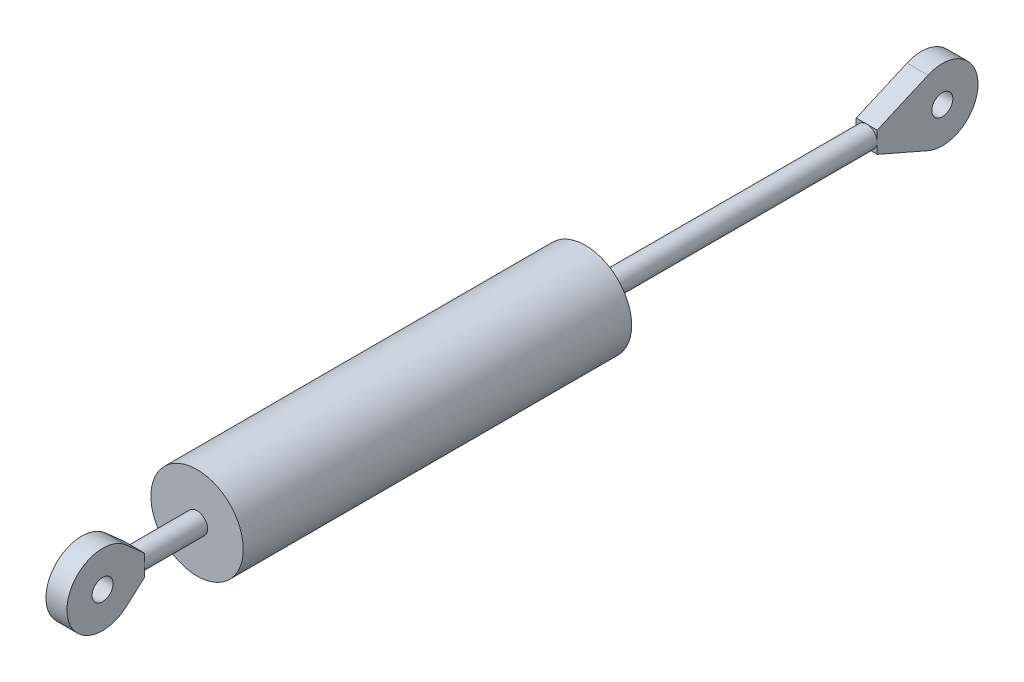
ISO-10303-21;
HEADER;
FILE_DESCRIPTION(('STEP AP214'),'2;1');
FILE_NAME('part.step','',(''),(''),'','','');
FILE_SCHEMA(('AUTOMOTIVE_DESIGN { 1 0 10303 214 1 1 1 1 }'));
ENDSEC;
DATA;
#1=APPLICATION_CONTEXT('core data for automotive mechanical design processes');
#2=APPLICATION_PROTOCOL_DEFINITION('international standard','automotive_design',2000,#1);
#3=PRODUCT_CONTEXT('',#1,'mechanical');
#4=PRODUCT('Part','Part','',(#3));
#5=PRODUCT_RELATED_PRODUCT_CATEGORY('part','',(#4));
#6=PRODUCT_DEFINITION_FORMATION('','',#4);
#7=PRODUCT_DEFINITION_CONTEXT('part definition',#1,'design');
#8=PRODUCT_DEFINITION('design','',#6,#7);
#9=PRODUCT_DEFINITION_SHAPE('','',#8);
#10=(LENGTH_UNIT() NAMED_UNIT(*) SI_UNIT(.MILLI.,.METRE.));
#11=(NAMED_UNIT(*) PLANE_ANGLE_UNIT() SI_UNIT($,.RADIAN.));
#12=(NAMED_UNIT(*) SI_UNIT($,.STERADIAN.) SOLID_ANGLE_UNIT());
#13=UNCERTAINTY_MEASURE_WITH_UNIT(LENGTH_MEASURE(1.E-05),#10,'distance_accuracy_value','');
#14=(GEOMETRIC_REPRESENTATION_CONTEXT(3) GLOBAL_UNCERTAINTY_ASSIGNED_CONTEXT((#13)) GLOBAL_UNIT_ASSIGNED_CONTEXT((#10,
#11,#12)) REPRESENTATION_CONTEXT('',''));
#15=CARTESIAN_POINT('',(0.,0.,0.));
#16=DIRECTION('',(0.,0.,1.));
#17=DIRECTION('',(1.,0.,0.));
#18=AXIS2_PLACEMENT_3D('',#15,#16,#17);
#19=CARTESIAN_POINT('',(0.,11.,46.25));
#20=DIRECTION('',(0.,0.,-1.));
#21=DIRECTION('',(-1.,0.,0.));
#22=AXIS2_PLACEMENT_3D('',#19,#20,#21);
#23=PLANE('',#22);
#24=CARTESIAN_POINT('',(0.,0.,46.25));
#25=DIRECTION('',(0.,0.,1.));
#26=DIRECTION('',(1.,0.,0.));
#27=AXIS2_PLACEMENT_3D('',#24,#25,#26);
#28=CIRCLE('',#27,2.5);
#29=CARTESIAN_POINT('',(2.5,0.,46.25));
#30=VERTEX_POINT('',#29);
#31=EDGE_CURVE('E43',#30,#30,#28,.T.);
#32=ORIENTED_EDGE('',*,*,#31,.F.);
#33=EDGE_LOOP('',(#32));
#34=FACE_BOUND('',#33,.T.);
#35=CARTESIAN_POINT('',(0.,0.,46.25));
#36=DIRECTION('',(0.,0.,1.));
#37=DIRECTION('',(1.,0.,0.));
#38=AXIS2_PLACEMENT_3D('',#35,#36,#37);
#39=CIRCLE('',#38,11.);
#40=CARTESIAN_POINT('',(11.,0.,46.25));
#41=VERTEX_POINT('',#40);
#42=EDGE_CURVE('E230',#41,#41,#39,.T.);
#43=ORIENTED_EDGE('',*,*,#42,.T.);
#44=EDGE_LOOP('',(#43));
#45=FACE_BOUND('',#44,.T.);
#46=ADVANCED_FACE('F35',(#34,#45),#23,.F.);
#47=CARTESIAN_POINT('',(0.,11.,-46.25));
#48=DIRECTION('',(0.,0.,1.));
#49=DIRECTION('',(1.,0.,0.));
#50=AXIS2_PLACEMENT_3D('',#47,#48,#49);
#51=PLANE('',#50);
#52=CARTESIAN_POINT('',(0.,0.,-46.25));
#53=DIRECTION('',(0.,0.,-1.));
#54=DIRECTION('',(-1.,0.,0.));
#55=AXIS2_PLACEMENT_3D('',#52,#53,#54);
#56=CIRCLE('',#55,2.5);
#57=CARTESIAN_POINT('',(-2.5,0.,-46.25));
#58=VERTEX_POINT('',#57);
#59=EDGE_CURVE('E11',#58,#58,#56,.T.);
#60=ORIENTED_EDGE('',*,*,#59,.F.);
#61=EDGE_LOOP('',(#60));
#62=FACE_BOUND('',#61,.T.);
#63=CARTESIAN_POINT('',(0.,0.,-46.25));
#64=DIRECTION('',(0.,0.,1.));
#65=DIRECTION('',(1.,0.,0.));
#66=AXIS2_PLACEMENT_3D('',#63,#64,#65);
#67=CIRCLE('',#66,11.);
#68=CARTESIAN_POINT('',(11.,0.,-46.25));
#69=VERTEX_POINT('',#68);
#70=EDGE_CURVE('E38',#69,#69,#67,.T.);
#71=ORIENTED_EDGE('',*,*,#70,.F.);
#72=EDGE_LOOP('',(#71));
#73=FACE_BOUND('',#72,.T.);
#74=ADVANCED_FACE('F241',(#62,#73),#51,.F.);
#75=CARTESIAN_POINT('',(0.,0.,46.25));
#76=DIRECTION('',(0.,0.,1.));
#77=DIRECTION('',(1.,0.,0.));
#78=AXIS2_PLACEMENT_3D('',#75,#76,#77);
#79=CYLINDRICAL_SURFACE('',#78,11.);
#80=ORIENTED_EDGE('',*,*,#42,.F.);
#81=EDGE_LOOP('',(#80));
#82=FACE_BOUND('',#81,.T.);
#83=ORIENTED_EDGE('',*,*,#70,.T.);
#84=EDGE_LOOP('',(#83));
#85=FACE_BOUND('',#84,.T.);
#86=ADVANCED_FACE('F239',(#82,#85),#79,.T.);
#87=CARTESIAN_POINT('',(0.,0.,61.25));
#88=DIRECTION('',(0.,0.,-1.));
#89=DIRECTION('',(-1.,0.,0.));
#90=AXIS2_PLACEMENT_3D('',#87,#88,#89);
#91=CYLINDRICAL_SURFACE('',#90,2.5);
#92=CARTESIAN_POINT('',(0.,0.,61.25));
#93=DIRECTION('',(0.,0.,1.));
#94=DIRECTION('',(1.,0.,0.));
#95=AXIS2_PLACEMENT_3D('',#92,#93,#94);
#96=CIRCLE('',#95,2.5);
#97=CARTESIAN_POINT('',(2.5,0.,61.25));
#98=VERTEX_POINT('',#97);
#99=CARTESIAN_POINT('',(0.,2.5,61.25));
#100=VERTEX_POINT('',#99);
#101=EDGE_CURVE('E227',#98,#100,#96,.T.);
#102=ORIENTED_EDGE('',*,*,#101,.F.);
#103=CARTESIAN_POINT('',(0.,-2.5,61.25));
#104=VERTEX_POINT('',#103);
#105=EDGE_CURVE('E218',#104,#98,#96,.T.);
#106=ORIENTED_EDGE('',*,*,#105,.F.);
#107=CARTESIAN_POINT('',(-2.5,0.,61.25));
#108=VERTEX_POINT('',#107);
#109=EDGE_CURVE('E485',#108,#104,#96,.T.);
#110=ORIENTED_EDGE('',*,*,#109,.F.);
#111=EDGE_CURVE('E231',#100,#108,#96,.T.);
#112=ORIENTED_EDGE('',*,*,#111,.F.);
#113=EDGE_LOOP('',(#102,#106,#110,#112));
#114=FACE_BOUND('',#113,.T.);
#115=ORIENTED_EDGE('',*,*,#31,.T.);
#116=EDGE_LOOP('',(#115));
#117=FACE_BOUND('',#116,.T.);
#118=ADVANCED_FACE('F248',(#114,#117),#91,.T.);
#119=CARTESIAN_POINT('',(-2.5,2.5,61.25));
#120=DIRECTION('',(0.,0.,-1.));
#121=DIRECTION('',(-1.,0.,0.));
#122=AXIS2_PLACEMENT_3D('',#119,#120,#121);
#123=PLANE('',#122);
#124=DIRECTION('',(0.,1.,0.));
#125=VECTOR('',#124,1.);
#126=CARTESIAN_POINT('',(2.5,2.5,61.25));
#127=LINE('',#126,#125);
#128=CARTESIAN_POINT('',(2.5,2.5,61.25));
#129=VERTEX_POINT('',#128);
#130=EDGE_CURVE('E185',#98,#129,#127,.T.);
#131=ORIENTED_EDGE('',*,*,#130,.F.);
#132=ORIENTED_EDGE('',*,*,#101,.T.);
#133=DIRECTION('',(1.,0.,0.));
#134=VECTOR('',#133,1.);
#135=CARTESIAN_POINT('',(-2.5,2.5,61.25));
#136=LINE('',#135,#134);
#137=EDGE_CURVE('E214',#100,#129,#136,.T.);
#138=ORIENTED_EDGE('',*,*,#137,.T.);
#139=EDGE_LOOP('',(#131,#132,#138));
#140=FACE_BOUND('',#139,.T.);
#141=ADVANCED_FACE('F256',(#140),#123,.T.);
#142=CARTESIAN_POINT('',(-2.5,2.5,61.25));
#143=VERTEX_POINT('',#142);
#144=EDGE_CURVE('E224',#143,#100,#136,.T.);
#145=ORIENTED_EDGE('',*,*,#144,.T.);
#146=ORIENTED_EDGE('',*,*,#111,.T.);
#147=DIRECTION('',(0.,1.,0.));
#148=VECTOR('',#147,1.);
#149=CARTESIAN_POINT('',(-2.5,2.5,61.25));
#150=LINE('',#149,#148);
#151=EDGE_CURVE('E201',#108,#143,#150,.T.);
#152=ORIENTED_EDGE('',*,*,#151,.T.);
#153=EDGE_LOOP('',(#145,#146,#152));
#154=FACE_BOUND('',#153,.T.);
#155=ADVANCED_FACE('F396',(#154),#123,.T.);
#156=CARTESIAN_POINT('',(-2.5,-2.5,61.25));
#157=VERTEX_POINT('',#156);
#158=EDGE_CURVE('E202',#157,#108,#150,.T.);
#159=ORIENTED_EDGE('',*,*,#158,.T.);
#160=ORIENTED_EDGE('',*,*,#109,.T.);
#161=DIRECTION('',(1.,0.,0.));
#162=VECTOR('',#161,1.);
#163=CARTESIAN_POINT('',(-2.5,-2.5,61.25));
#164=LINE('',#163,#162);
#165=EDGE_CURVE('E215',#157,#104,#164,.T.);
#166=ORIENTED_EDGE('',*,*,#165,.F.);
#167=EDGE_LOOP('',(#159,#160,#166));
#168=FACE_BOUND('',#167,.T.);
#169=ADVANCED_FACE('F262',(#168),#123,.T.);
#170=CARTESIAN_POINT('',(2.5,-2.5,61.25));
#171=VERTEX_POINT('',#170);
#172=EDGE_CURVE('E219',#104,#171,#164,.T.);
#173=ORIENTED_EDGE('',*,*,#172,.F.);
#174=ORIENTED_EDGE('',*,*,#105,.T.);
#175=EDGE_CURVE('E186',#171,#98,#127,.T.);
#176=ORIENTED_EDGE('',*,*,#175,.F.);
#177=EDGE_LOOP('',(#173,#174,#176));
#178=FACE_BOUND('',#177,.T.);
#179=ADVANCED_FACE('F258',(#178),#123,.T.);
#180=CARTESIAN_POINT('',(-2.5,-2.5,61.25));
#181=DIRECTION('',(0.,-0.748795472454104,-0.662801131888167));
#182=DIRECTION('',(0.,0.662801131888167,-0.748795472454104));
#183=AXIS2_PLACEMENT_3D('',#180,#181,#182);
#184=PLANE('',#183);
#185=ORIENTED_EDGE('',*,*,#165,.T.);
#186=ORIENTED_EDGE('',*,*,#172,.T.);
#187=DIRECTION('',(0.,0.662801131888167,-0.748795472454104));
#188=VECTOR('',#187,1.);
#189=CARTESIAN_POINT('',(2.5,-2.5,61.25));
#190=LINE('',#189,#188);
#191=CARTESIAN_POINT('',(2.5,-6.36476151588251,65.6161903789506));
#192=VERTEX_POINT('',#191);
#193=EDGE_CURVE('E195',#192,#171,#190,.T.);
#194=ORIENTED_EDGE('',*,*,#193,.F.);
#195=DIRECTION('',(1.,0.,0.));
#196=VECTOR('',#195,1.);
#197=CARTESIAN_POINT('',(-2.5,-6.36476151588251,65.6161903789506));
#198=LINE('',#197,#196);
#199=CARTESIAN_POINT('',(-2.5,-6.36476151588251,65.6161903789506));
#200=VERTEX_POINT('',#199);
#201=EDGE_CURVE('E220',#200,#192,#198,.T.);
#202=ORIENTED_EDGE('',*,*,#201,.F.);
#203=DIRECTION('',(0.,0.662801131888167,-0.748795472454104));
#204=VECTOR('',#203,1.);
#205=CARTESIAN_POINT('',(-2.5,-2.5,61.25));
#206=LINE('',#205,#204);
#207=EDGE_CURVE('E211',#200,#157,#206,.T.);
#208=ORIENTED_EDGE('',*,*,#207,.T.);
#209=EDGE_LOOP('',(#185,#186,#194,#202,#208));
#210=FACE_BOUND('',#209,.T.);
#211=ADVANCED_FACE('F261',(#210),#184,.T.);
#212=CARTESIAN_POINT('',(-2.5,-2.26303351058554E-11,71.25));
#213=DIRECTION('',(1.,0.,0.));
#214=DIRECTION('',(0.,0.,-1.));
#215=AXIS2_PLACEMENT_3D('',#212,#213,#214);
#216=CYLINDRICAL_SURFACE('',#215,8.50000000000001);
#217=ORIENTED_EDGE('',*,*,#201,.T.);
#218=CARTESIAN_POINT('',(2.5,-2.26303351058554E-11,71.25));
#219=DIRECTION('',(1.,0.,0.));
#220=DIRECTION('',(0.,0.,-1.));
#221=AXIS2_PLACEMENT_3D('',#218,#219,#220);
#222=CIRCLE('',#221,8.50000000000001);
#223=CARTESIAN_POINT('',(2.5,6.36476151587,65.6161903789875));
#224=VERTEX_POINT('',#223);
#225=EDGE_CURVE('E192',#224,#192,#222,.T.);
#226=ORIENTED_EDGE('',*,*,#225,.F.);
#227=DIRECTION('',(1.,0.,0.));
#228=VECTOR('',#227,1.);
#229=CARTESIAN_POINT('',(-2.5,6.36476151587,65.6161903789875));
#230=LINE('',#229,#228);
#231=CARTESIAN_POINT('',(-2.5,6.36476151587,65.6161903789875));
#232=VERTEX_POINT('',#231);
#233=EDGE_CURVE('E222',#232,#224,#230,.T.);
#234=ORIENTED_EDGE('',*,*,#233,.F.);
#235=CARTESIAN_POINT('',(-2.5,-2.26303351058554E-11,71.25));
#236=DIRECTION('',(1.,0.,0.));
#237=DIRECTION('',(0.,0.,-1.));
#238=AXIS2_PLACEMENT_3D('',#235,#236,#237);
#239=CIRCLE('',#238,8.50000000000001);
#240=EDGE_CURVE('E208',#232,#200,#239,.T.);
#241=ORIENTED_EDGE('',*,*,#240,.T.);
#242=EDGE_LOOP('',(#217,#226,#234,#241));
#243=FACE_BOUND('',#242,.T.);
#244=ADVANCED_FACE('F268',(#243),#216,.T.);
#245=CARTESIAN_POINT('',(-2.5,2.5,61.25));
#246=DIRECTION('',(0.,0.748795472457952,-0.66280113188382));
#247=DIRECTION('',(0.,0.66280113188382,0.748795472457952));
#248=AXIS2_PLACEMENT_3D('',#245,#246,#247);
#249=PLANE('',#248);
#250=ORIENTED_EDGE('',*,*,#233,.T.);
#251=DIRECTION('',(0.,0.66280113188382,0.748795472457952));
#252=VECTOR('',#251,1.);
#253=CARTESIAN_POINT('',(2.5,2.5,61.25));
#254=LINE('',#253,#252);
#255=EDGE_CURVE('E189',#129,#224,#254,.T.);
#256=ORIENTED_EDGE('',*,*,#255,.F.);
#257=ORIENTED_EDGE('',*,*,#137,.F.);
#258=ORIENTED_EDGE('',*,*,#144,.F.);
#259=DIRECTION('',(0.,0.66280113188382,0.748795472457952));
#260=VECTOR('',#259,1.);
#261=CARTESIAN_POINT('',(-2.5,2.5,61.25));
#262=LINE('',#261,#260);
#263=EDGE_CURVE('E205',#143,#232,#262,.T.);
#264=ORIENTED_EDGE('',*,*,#263,.T.);
#265=EDGE_LOOP('',(#250,#256,#257,#258,#264));
#266=FACE_BOUND('',#265,.T.);
#267=ADVANCED_FACE('F264',(#266),#249,.T.);
#268=CARTESIAN_POINT('',(-2.5,-2.26303351058554E-11,71.25));
#269=DIRECTION('',(1.,0.,0.));
#270=DIRECTION('',(0.,0.,-1.));
#271=AXIS2_PLACEMENT_3D('',#268,#269,#270);
#272=PLANE('',#271);
#273=CARTESIAN_POINT('',(-2.5,-2.26303351058554E-11,71.25));
#274=DIRECTION('',(1.,0.,0.));
#275=DIRECTION('',(0.,0.,-1.));
#276=AXIS2_PLACEMENT_3D('',#273,#274,#275);
#277=CIRCLE('',#276,2.5);
#278=CARTESIAN_POINT('',(-2.5,-2.26303351058554E-11,68.75));
#279=VERTEX_POINT('',#278);
#280=EDGE_CURVE('E198',#279,#279,#277,.T.);
#281=ORIENTED_EDGE('',*,*,#280,.T.);
#282=EDGE_LOOP('',(#281));
#283=FACE_BOUND('',#282,.T.);
#284=ORIENTED_EDGE('',*,*,#158,.F.);
#285=ORIENTED_EDGE('',*,*,#207,.F.);
#286=ORIENTED_EDGE('',*,*,#240,.F.);
#287=ORIENTED_EDGE('',*,*,#263,.F.);
#288=ORIENTED_EDGE('',*,*,#151,.F.);
#289=EDGE_LOOP('',(#284,#285,#286,#287,#288));
#290=FACE_BOUND('',#289,.T.);
#291=ADVANCED_FACE('F267',(#283,#290),#272,.F.);
#292=CARTESIAN_POINT('',(-2.5,-2.26303351058554E-11,71.25));
#293=DIRECTION('',(1.,0.,0.));
#294=DIRECTION('',(0.,0.,-1.));
#295=AXIS2_PLACEMENT_3D('',#292,#293,#294);
#296=CYLINDRICAL_SURFACE('',#295,2.5);
#297=ORIENTED_EDGE('',*,*,#280,.F.);
#298=EDGE_LOOP('',(#297));
#299=FACE_BOUND('',#298,.T.);
#300=CARTESIAN_POINT('',(2.5,-2.26303351058554E-11,71.25));
#301=DIRECTION('',(1.,0.,0.));
#302=DIRECTION('',(0.,0.,-1.));
#303=AXIS2_PLACEMENT_3D('',#300,#301,#302);
#304=CIRCLE('',#303,2.5);
#305=CARTESIAN_POINT('',(2.5,-2.26303351058554E-11,68.75));
#306=VERTEX_POINT('',#305);
#307=EDGE_CURVE('E180',#306,#306,#304,.T.);
#308=ORIENTED_EDGE('',*,*,#307,.T.);
#309=EDGE_LOOP('',(#308));
#310=FACE_BOUND('',#309,.T.);
#311=ADVANCED_FACE('F278',(#299,#310),#296,.F.);
#312=CARTESIAN_POINT('',(2.5,-2.26303351058554E-11,71.25));
#313=DIRECTION('',(1.,0.,0.));
#314=DIRECTION('',(0.,0.,-1.));
#315=AXIS2_PLACEMENT_3D('',#312,#313,#314);
#316=PLANE('',#315);
#317=ORIENTED_EDGE('',*,*,#175,.T.);
#318=ORIENTED_EDGE('',*,*,#130,.T.);
#319=ORIENTED_EDGE('',*,*,#255,.T.);
#320=ORIENTED_EDGE('',*,*,#225,.T.);
#321=ORIENTED_EDGE('',*,*,#193,.T.);
#322=EDGE_LOOP('',(#317,#318,#319,#320,#321));
#323=FACE_BOUND('',#322,.T.);
#324=ORIENTED_EDGE('',*,*,#307,.F.);
#325=EDGE_LOOP('',(#324));
#326=FACE_BOUND('',#325,.T.);
#327=ADVANCED_FACE('F282',(#323,#326),#316,.T.);
#328=CARTESIAN_POINT('',(0.,0.,-113.25));
#329=DIRECTION('',(0.,0.,1.));
#330=DIRECTION('',(1.,0.,0.));
#331=AXIS2_PLACEMENT_3D('',#328,#329,#330);
#332=CYLINDRICAL_SURFACE('',#331,2.5);
#333=CARTESIAN_POINT('',(0.,0.,-113.25));
#334=DIRECTION('',(0.,0.,-1.));
#335=DIRECTION('',(-1.,0.,0.));
#336=AXIS2_PLACEMENT_3D('',#333,#334,#335);
#337=CIRCLE('',#336,2.5);
#338=CARTESIAN_POINT('',(-2.5,0.,-113.25));
#339=VERTEX_POINT('',#338);
#340=CARTESIAN_POINT('',(0.,2.5,-113.25));
#341=VERTEX_POINT('',#340);
#342=EDGE_CURVE('E178',#339,#341,#337,.T.);
#343=ORIENTED_EDGE('',*,*,#342,.F.);
#344=CARTESIAN_POINT('',(0.,-2.5,-113.25));
#345=VERTEX_POINT('',#344);
#346=EDGE_CURVE('E51',#345,#339,#337,.T.);
#347=ORIENTED_EDGE('',*,*,#346,.F.);
#348=CARTESIAN_POINT('',(2.5,0.,-113.25));
#349=VERTEX_POINT('',#348);
#350=EDGE_CURVE('E55',#349,#345,#337,.T.);
#351=ORIENTED_EDGE('',*,*,#350,.F.);
#352=EDGE_CURVE('E181',#341,#349,#337,.T.);
#353=ORIENTED_EDGE('',*,*,#352,.F.);
#354=EDGE_LOOP('',(#343,#347,#351,#353));
#355=FACE_BOUND('',#354,.T.);
#356=ORIENTED_EDGE('',*,*,#59,.T.);
#357=EDGE_LOOP('',(#356));
#358=FACE_BOUND('',#357,.T.);
#359=ADVANCED_FACE('F286',(#355,#358),#332,.T.);
#360=CARTESIAN_POINT('',(-2.5,2.5,-113.25));
#361=DIRECTION('',(0.,0.,1.));
#362=DIRECTION('',(1.,0.,0.));
#363=AXIS2_PLACEMENT_3D('',#360,#361,#362);
#364=PLANE('',#363);
#365=DIRECTION('',(0.,-1.,0.));
#366=VECTOR('',#365,1.);
#367=CARTESIAN_POINT('',(-2.5,2.5,-113.25));
#368=LINE('',#367,#366);
#369=CARTESIAN_POINT('',(-2.5,2.5,-113.25));
#370=VERTEX_POINT('',#369);
#371=EDGE_CURVE('E161',#370,#339,#368,.T.);
#372=ORIENTED_EDGE('',*,*,#371,.T.);
#373=ORIENTED_EDGE('',*,*,#342,.T.);
#374=DIRECTION('',(1.,0.,0.));
#375=VECTOR('',#374,1.);
#376=CARTESIAN_POINT('',(-2.5,2.5,-113.25));
#377=LINE('',#376,#375);
#378=EDGE_CURVE('E171',#370,#341,#377,.T.);
#379=ORIENTED_EDGE('',*,*,#378,.F.);
#380=EDGE_LOOP('',(#372,#373,#379));
#381=FACE_BOUND('',#380,.T.);
#382=ADVANCED_FACE('F290',(#381),#364,.T.);
#383=CARTESIAN_POINT('',(2.5,2.5,-113.25));
#384=VERTEX_POINT('',#383);
#385=EDGE_CURVE('E174',#341,#384,#377,.T.);
#386=ORIENTED_EDGE('',*,*,#385,.F.);
#387=ORIENTED_EDGE('',*,*,#352,.T.);
#388=DIRECTION('',(0.,-1.,0.));
#389=VECTOR('',#388,1.);
#390=CARTESIAN_POINT('',(2.5,2.5,-113.25));
#391=LINE('',#390,#389);
#392=EDGE_CURVE('E134',#384,#349,#391,.T.);
#393=ORIENTED_EDGE('',*,*,#392,.F.);
#394=EDGE_LOOP('',(#386,#387,#393));
#395=FACE_BOUND('',#394,.T.);
#396=ADVANCED_FACE('F346',(#395),#364,.T.);
#397=CARTESIAN_POINT('',(2.5,-2.5,-113.25));
#398=VERTEX_POINT('',#397);
#399=EDGE_CURVE('E124',#349,#398,#391,.T.);
#400=ORIENTED_EDGE('',*,*,#399,.F.);
#401=ORIENTED_EDGE('',*,*,#350,.T.);
#402=DIRECTION('',(1.,0.,0.));
#403=VECTOR('',#402,1.);
#404=CARTESIAN_POINT('',(-2.5,-2.5,-113.25));
#405=LINE('',#404,#403);
#406=EDGE_CURVE('E139',#345,#398,#405,.T.);
#407=ORIENTED_EDGE('',*,*,#406,.T.);
#408=EDGE_LOOP('',(#400,#401,#407));
#409=FACE_BOUND('',#408,.T.);
#410=ADVANCED_FACE('F140',(#409),#364,.T.);
#411=CARTESIAN_POINT('',(-2.5,-2.5,-113.25));
#412=VERTEX_POINT('',#411);
#413=EDGE_CURVE('E144',#412,#345,#405,.T.);
#414=ORIENTED_EDGE('',*,*,#413,.T.);
#415=ORIENTED_EDGE('',*,*,#346,.T.);
#416=EDGE_CURVE('E160',#339,#412,#368,.T.);
#417=ORIENTED_EDGE('',*,*,#416,.T.);
#418=EDGE_LOOP('',(#414,#415,#417));
#419=FACE_BOUND('',#418,.T.);
#420=ADVANCED_FACE('F291',(#419),#364,.T.);
#421=CARTESIAN_POINT('',(-2.5,2.5,-113.25));
#422=DIRECTION('',(0.,0.916250998490399,0.400604677662839));
#423=DIRECTION('',(0.,-0.400604677662839,0.916250998490399));
#424=AXIS2_PLACEMENT_3D('',#421,#422,#423);
#425=PLANE('',#424);
#426=ORIENTED_EDGE('',*,*,#378,.T.);
#427=ORIENTED_EDGE('',*,*,#385,.T.);
#428=DIRECTION('',(0.,-0.400604677662839,0.916250998490399));
#429=VECTOR('',#428,1.);
#430=CARTESIAN_POINT('',(2.5,2.5,-113.25));
#431=LINE('',#430,#429);
#432=CARTESIAN_POINT('',(2.5,7.78813348716839,-125.344860239866));
#433=VERTEX_POINT('',#432);
#434=EDGE_CURVE('E152',#433,#384,#431,.T.);
#435=ORIENTED_EDGE('',*,*,#434,.F.);
#436=DIRECTION('',(1.,0.,0.));
#437=VECTOR('',#436,1.);
#438=CARTESIAN_POINT('',(-2.5,7.78813348716839,-125.344860239866));
#439=LINE('',#438,#437);
#440=CARTESIAN_POINT('',(-2.5,7.78813348716839,-125.344860239866));
#441=VERTEX_POINT('',#440);
#442=EDGE_CURVE('E175',#441,#433,#439,.T.);
#443=ORIENTED_EDGE('',*,*,#442,.F.);
#444=DIRECTION('',(0.,-0.400604677662839,0.916250998490399));
#445=VECTOR('',#444,1.);
#446=CARTESIAN_POINT('',(-2.5,2.5,-113.25));
#447=LINE('',#446,#445);
#448=EDGE_CURVE('E145',#441,#370,#447,.T.);
#449=ORIENTED_EDGE('',*,*,#448,.T.);
#450=EDGE_LOOP('',(#426,#427,#435,#443,#449));
#451=FACE_BOUND('',#450,.T.);
#452=ADVANCED_FACE('F294',(#451),#425,.T.);
#453=CARTESIAN_POINT('',(-2.5,0.,-128.75));
#454=DIRECTION('',(1.,0.,0.));
#455=DIRECTION('',(0.,0.,-1.));
#456=AXIS2_PLACEMENT_3D('',#453,#454,#455);
#457=CYLINDRICAL_SURFACE('',#456,8.5);
#458=ORIENTED_EDGE('',*,*,#442,.T.);
#459=CARTESIAN_POINT('',(2.5,0.,-128.75));
#460=DIRECTION('',(1.,0.,0.));
#461=DIRECTION('',(0.,0.,-1.));
#462=AXIS2_PLACEMENT_3D('',#459,#460,#461);
#463=CIRCLE('',#462,8.5);
#464=CARTESIAN_POINT('',(2.5,-7.78813348716839,-125.344860239866));
#465=VERTEX_POINT('',#464);
#466=EDGE_CURVE('E150',#465,#433,#463,.T.);
#467=ORIENTED_EDGE('',*,*,#466,.F.);
#468=DIRECTION('',(1.,0.,0.));
#469=VECTOR('',#468,1.);
#470=CARTESIAN_POINT('',(-2.5,-7.78813348716839,-125.344860239866));
#471=LINE('',#470,#469);
#472=CARTESIAN_POINT('',(-2.5,-7.78813348716839,-125.344860239866));
#473=VERTEX_POINT('',#472);
#474=EDGE_CURVE('E149',#473,#465,#471,.T.);
#475=ORIENTED_EDGE('',*,*,#474,.F.);
#476=CARTESIAN_POINT('',(-2.5,0.,-128.75));
#477=DIRECTION('',(1.,0.,0.));
#478=DIRECTION('',(0.,0.,-1.));
#479=AXIS2_PLACEMENT_3D('',#476,#477,#478);
#480=CIRCLE('',#479,8.5);
#481=EDGE_CURVE('E166',#473,#441,#480,.T.);
#482=ORIENTED_EDGE('',*,*,#481,.T.);
#483=EDGE_LOOP('',(#458,#467,#475,#482));
#484=FACE_BOUND('',#483,.T.);
#485=ADVANCED_FACE('F299',(#484),#457,.T.);
#486=CARTESIAN_POINT('',(-2.5,-2.5,-113.25));
#487=DIRECTION('',(0.,-0.916250998490399,0.400604677662839));
#488=DIRECTION('',(0.,-0.400604677662839,-0.916250998490399));
#489=AXIS2_PLACEMENT_3D('',#486,#487,#488);
#490=PLANE('',#489);
#491=ORIENTED_EDGE('',*,*,#474,.T.);
#492=DIRECTION('',(0.,-0.400604677662839,-0.916250998490399));
#493=VECTOR('',#492,1.);
#494=CARTESIAN_POINT('',(2.5,-2.5,-113.25));
#495=LINE('',#494,#493);
#496=EDGE_CURVE('E130',#398,#465,#495,.T.);
#497=ORIENTED_EDGE('',*,*,#496,.F.);
#498=ORIENTED_EDGE('',*,*,#406,.F.);
#499=ORIENTED_EDGE('',*,*,#413,.F.);
#500=DIRECTION('',(0.,-0.400604677662839,-0.916250998490399));
#501=VECTOR('',#500,1.);
#502=CARTESIAN_POINT('',(-2.5,-2.5,-113.25));
#503=LINE('',#502,#501);
#504=EDGE_CURVE('E164',#412,#473,#503,.T.);
#505=ORIENTED_EDGE('',*,*,#504,.T.);
#506=EDGE_LOOP('',(#491,#497,#498,#499,#505));
#507=FACE_BOUND('',#506,.T.);
#508=ADVANCED_FACE('F147',(#507),#490,.T.);
#509=CARTESIAN_POINT('',(-2.5,0.,-128.75));
#510=DIRECTION('',(1.,0.,0.));
#511=DIRECTION('',(0.,0.,-1.));
#512=AXIS2_PLACEMENT_3D('',#509,#510,#511);
#513=PLANE('',#512);
#514=CARTESIAN_POINT('',(-2.5,0.,-128.75));
#515=DIRECTION('',(1.,0.,0.));
#516=DIRECTION('',(0.,0.,-1.));
#517=AXIS2_PLACEMENT_3D('',#514,#515,#516);
#518=CIRCLE('',#517,2.5);
#519=CARTESIAN_POINT('',(-2.5,0.,-131.25));
#520=VERTEX_POINT('',#519);
#521=EDGE_CURVE('E157',#520,#520,#518,.T.);
#522=ORIENTED_EDGE('',*,*,#521,.T.);
#523=EDGE_LOOP('',(#522));
#524=FACE_BOUND('',#523,.T.);
#525=ORIENTED_EDGE('',*,*,#371,.F.);
#526=ORIENTED_EDGE('',*,*,#448,.F.);
#527=ORIENTED_EDGE('',*,*,#481,.F.);
#528=ORIENTED_EDGE('',*,*,#504,.F.);
#529=ORIENTED_EDGE('',*,*,#416,.F.);
#530=EDGE_LOOP('',(#525,#526,#527,#528,#529));
#531=FACE_BOUND('',#530,.T.);
#532=ADVANCED_FACE('F298',(#524,#531),#513,.F.);
#533=CARTESIAN_POINT('',(-2.5,0.,-128.75));
#534=DIRECTION('',(1.,0.,0.));
#535=DIRECTION('',(0.,0.,-1.));
#536=AXIS2_PLACEMENT_3D('',#533,#534,#535);
#537=CYLINDRICAL_SURFACE('',#536,2.5);
#538=ORIENTED_EDGE('',*,*,#521,.F.);
#539=EDGE_LOOP('',(#538));
#540=FACE_BOUND('',#539,.T.);
#541=CARTESIAN_POINT('',(2.5,0.,-128.75));
#542=DIRECTION('',(1.,0.,0.));
#543=DIRECTION('',(0.,0.,-1.));
#544=AXIS2_PLACEMENT_3D('',#541,#542,#543);
#545=CIRCLE('',#544,2.5);
#546=CARTESIAN_POINT('',(2.5,0.,-131.25));
#547=VERTEX_POINT('',#546);
#548=EDGE_CURVE('E136',#547,#547,#545,.T.);
#549=ORIENTED_EDGE('',*,*,#548,.T.);
#550=EDGE_LOOP('',(#549));
#551=FACE_BOUND('',#550,.T.);
#552=ADVANCED_FACE('F308',(#540,#551),#537,.F.);
#553=CARTESIAN_POINT('',(2.5,0.,-128.75));
#554=DIRECTION('',(1.,0.,0.));
#555=DIRECTION('',(0.,0.,-1.));
#556=AXIS2_PLACEMENT_3D('',#553,#554,#555);
#557=PLANE('',#556);
#558=ORIENTED_EDGE('',*,*,#392,.T.);
#559=ORIENTED_EDGE('',*,*,#399,.T.);
#560=ORIENTED_EDGE('',*,*,#496,.T.);
#561=ORIENTED_EDGE('',*,*,#466,.T.);
#562=ORIENTED_EDGE('',*,*,#434,.T.);
#563=EDGE_LOOP('',(#558,#559,#560,#561,#562));
#564=FACE_BOUND('',#563,.T.);
#565=ORIENTED_EDGE('',*,*,#548,.F.);
#566=EDGE_LOOP('',(#565));
#567=FACE_BOUND('',#566,.T.);
#568=ADVANCED_FACE('F126',(#564,#567),#557,.T.);
#569=CLOSED_SHELL('',(#46,#74,#86,#118,#141,#155,#169,#179,#211,#244,#267,#291,#311,#327,#359,
#382,#396,#410,#420,#452,#485,#508,#532,#552,#568));
#570=MANIFOLD_SOLID_BREP('B2',#569);
#571=ADVANCED_BREP_SHAPE_REPRESENTATION('',(#18,#570),#14);
#572=SHAPE_DEFINITION_REPRESENTATION(#9,#571);
ENDSEC;
END-ISO-10303-21;
